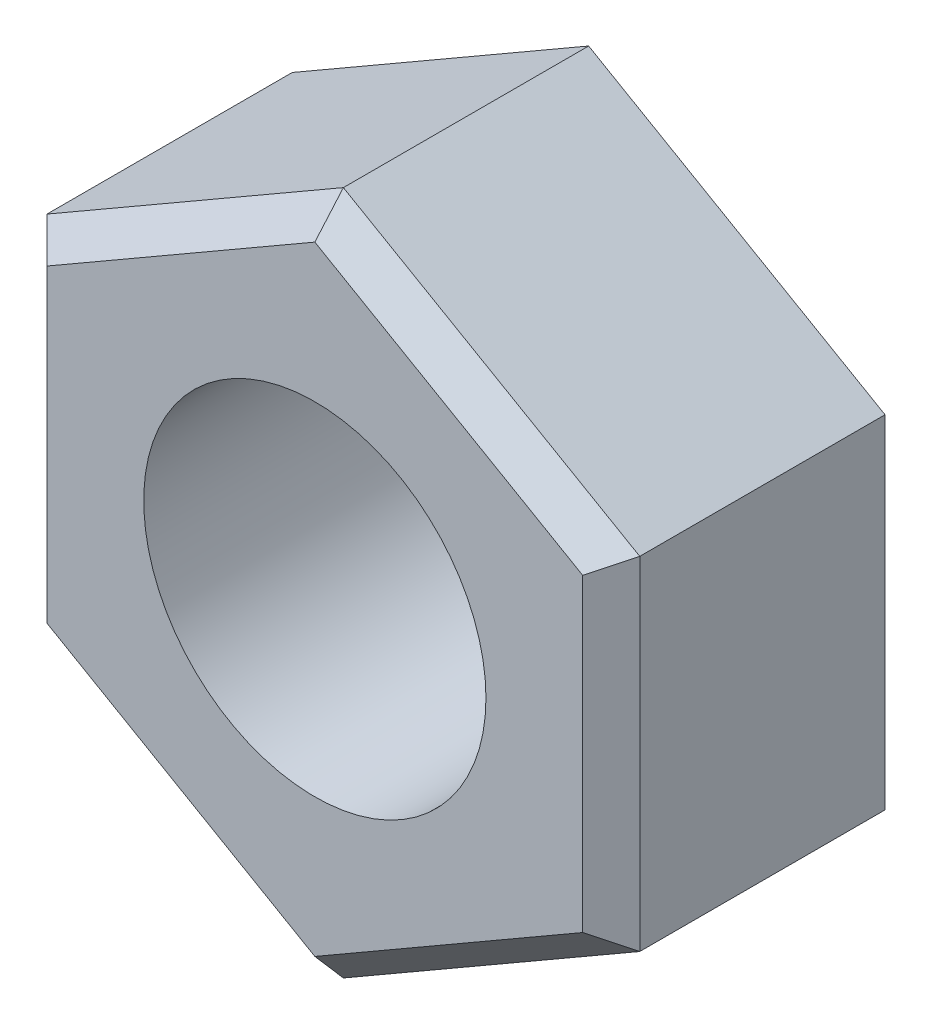
ISO-10303-21;
HEADER;
FILE_DESCRIPTION(('STEP AP214'),'2;1');
FILE_NAME('part.step','',(''),(''),'','','');
FILE_SCHEMA(('AUTOMOTIVE_DESIGN { 1 0 10303 214 1 1 1 1 }'));
ENDSEC;
DATA;
#1=APPLICATION_CONTEXT('core data for automotive mechanical design processes');
#2=APPLICATION_PROTOCOL_DEFINITION('international standard','automotive_design',2000,#1);
#3=PRODUCT_CONTEXT('',#1,'mechanical');
#4=PRODUCT('Part','Part','',(#3));
#5=PRODUCT_RELATED_PRODUCT_CATEGORY('part','',(#4));
#6=PRODUCT_DEFINITION_FORMATION('','',#4);
#7=PRODUCT_DEFINITION_CONTEXT('part definition',#1,'design');
#8=PRODUCT_DEFINITION('design','',#6,#7);
#9=PRODUCT_DEFINITION_SHAPE('','',#8);
#10=(LENGTH_UNIT() NAMED_UNIT(*) SI_UNIT(.MILLI.,.METRE.));
#11=(NAMED_UNIT(*) PLANE_ANGLE_UNIT() SI_UNIT($,.RADIAN.));
#12=(NAMED_UNIT(*) SI_UNIT($,.STERADIAN.) SOLID_ANGLE_UNIT());
#13=UNCERTAINTY_MEASURE_WITH_UNIT(LENGTH_MEASURE(1.E-05),#10,'distance_accuracy_value','');
#14=(GEOMETRIC_REPRESENTATION_CONTEXT(3) GLOBAL_UNCERTAINTY_ASSIGNED_CONTEXT((#13)) GLOBAL_UNIT_ASSIGNED_CONTEXT((#10,
#11,#12)) REPRESENTATION_CONTEXT('',''));
#15=CARTESIAN_POINT('',(0.,0.,0.));
#16=DIRECTION('',(0.,0.,1.));
#17=DIRECTION('',(1.,0.,0.));
#18=AXIS2_PLACEMENT_3D('',#15,#16,#17);
#19=CARTESIAN_POINT('',(0.,0.,2.4));
#20=DIRECTION('',(0.,0.,1.));
#21=DIRECTION('',(1.,0.,0.));
#22=AXIS2_PLACEMENT_3D('',#19,#20,#21);
#23=PLANE('',#22);
#24=DIRECTION('',(0.,1.,0.));
#25=VECTOR('',#24,1.);
#26=CARTESIAN_POINT('',(2.34807621135331,1.50000000000001,2.4));
#27=LINE('',#26,#25);
#28=CARTESIAN_POINT('',(2.34807621135332,-1.35566243270259,2.4));
#29=VERTEX_POINT('',#28);
#30=CARTESIAN_POINT('',(2.34807621135331,1.3556624327026,2.4));
#31=VERTEX_POINT('',#30);
#32=EDGE_CURVE('E175',#29,#31,#27,.T.);
#33=ORIENTED_EDGE('',*,*,#32,.T.);
#34=DIRECTION('',(-0.866025403784442,0.499999999999995,0.));
#35=VECTOR('',#34,1.);
#36=CARTESIAN_POINT('',(-0.125000000000019,2.78349364905389,2.4));
#37=LINE('',#36,#35);
#38=CARTESIAN_POINT('',(0.,2.71132486540519,2.4));
#39=VERTEX_POINT('',#38);
#40=EDGE_CURVE('E187',#31,#39,#37,.T.);
#41=ORIENTED_EDGE('',*,*,#40,.T.);
#42=DIRECTION('',(-0.866025403784435,-0.500000000000007,0.));
#43=VECTOR('',#42,1.);
#44=CARTESIAN_POINT('',(-2.47307621135333,1.28349364905387,2.4));
#45=LINE('',#44,#43);
#46=CARTESIAN_POINT('',(-2.34807621135333,1.35566243270257,2.4));
#47=VERTEX_POINT('',#46);
#48=EDGE_CURVE('E184',#39,#47,#45,.T.);
#49=ORIENTED_EDGE('',*,*,#48,.T.);
#50=DIRECTION('',(0.,-1.,0.));
#51=VECTOR('',#50,1.);
#52=CARTESIAN_POINT('',(-2.3480762113533,-1.50000000000003,2.4));
#53=LINE('',#52,#51);
#54=CARTESIAN_POINT('',(-2.3480762113533,-1.35566243270262,2.4));
#55=VERTEX_POINT('',#54);
#56=EDGE_CURVE('E181',#47,#55,#53,.T.);
#57=ORIENTED_EDGE('',*,*,#56,.T.);
#58=DIRECTION('',(0.866025403784442,-0.499999999999995,0.));
#59=VECTOR('',#58,1.);
#60=CARTESIAN_POINT('',(0.124999999999998,-2.78349364905389,2.4));
#61=LINE('',#60,#59);
#62=CARTESIAN_POINT('',(0.,-2.71132486540519,2.4));
#63=VERTEX_POINT('',#62);
#64=EDGE_CURVE('E178',#55,#63,#61,.T.);
#65=ORIENTED_EDGE('',*,*,#64,.T.);
#66=DIRECTION('',(0.866025403784438,0.500000000000001,0.));
#67=VECTOR('',#66,1.);
#68=CARTESIAN_POINT('',(2.47307621135332,-1.28349364905389,2.4));
#69=LINE('',#68,#67);
#70=EDGE_CURVE('E120',#63,#29,#69,.T.);
#71=ORIENTED_EDGE('',*,*,#70,.T.);
#72=EDGE_LOOP('',(#33,#41,#49,#57,#65,#71));
#73=FACE_BOUND('',#72,.T.);
#74=CARTESIAN_POINT('',(0.,0.,2.4));
#75=DIRECTION('',(0.,0.,1.));
#76=DIRECTION('',(1.,0.,0.));
#77=AXIS2_PLACEMENT_3D('',#74,#75,#76);
#78=CIRCLE('',#77,1.5);
#79=CARTESIAN_POINT('',(1.5,0.,2.4));
#80=VERTEX_POINT('',#79);
#81=EDGE_CURVE('E139',#80,#80,#78,.T.);
#82=ORIENTED_EDGE('',*,*,#81,.F.);
#83=EDGE_LOOP('',(#82));
#84=FACE_BOUND('',#83,.T.);
#85=ADVANCED_FACE('F40',(#73,#84),#23,.T.);
#86=CARTESIAN_POINT('',(0.,0.,0.));
#87=DIRECTION('',(0.,0.,1.));
#88=DIRECTION('',(1.,0.,0.));
#89=AXIS2_PLACEMENT_3D('',#86,#87,#88);
#90=PLANE('',#89);
#91=DIRECTION('',(0.866025403784441,-0.499999999999995,0.));
#92=VECTOR('',#91,1.);
#93=CARTESIAN_POINT('',(-2.5980762113533,-1.50000000000003,0.));
#94=LINE('',#93,#92);
#95=CARTESIAN_POINT('',(-2.5980762113533,-1.50000000000003,0.));
#96=VERTEX_POINT('',#95);
#97=CARTESIAN_POINT('',(0.,-3.,0.));
#98=VERTEX_POINT('',#97);
#99=EDGE_CURVE('E128',#96,#98,#94,.T.);
#100=ORIENTED_EDGE('',*,*,#99,.F.);
#101=DIRECTION('',(0.,-1.,0.));
#102=VECTOR('',#101,1.);
#103=CARTESIAN_POINT('',(-2.59807621135333,1.49999999999998,0.));
#104=LINE('',#103,#102);
#105=CARTESIAN_POINT('',(-2.59807621135333,1.49999999999998,0.));
#106=VERTEX_POINT('',#105);
#107=EDGE_CURVE('E157',#106,#96,#104,.T.);
#108=ORIENTED_EDGE('',*,*,#107,.F.);
#109=DIRECTION('',(-0.866025403784435,-0.500000000000007,0.));
#110=VECTOR('',#109,1.);
#111=CARTESIAN_POINT('',(0.,3.,0.));
#112=LINE('',#111,#110);
#113=CARTESIAN_POINT('',(0.,3.,0.));
#114=VERTEX_POINT('',#113);
#115=EDGE_CURVE('E153',#114,#106,#112,.T.);
#116=ORIENTED_EDGE('',*,*,#115,.F.);
#117=DIRECTION('',(-0.866025403784441,0.499999999999995,0.));
#118=VECTOR('',#117,1.);
#119=CARTESIAN_POINT('',(2.59807621135331,1.50000000000001,0.));
#120=LINE('',#119,#118);
#121=CARTESIAN_POINT('',(2.59807621135331,1.50000000000001,0.));
#122=VERTEX_POINT('',#121);
#123=EDGE_CURVE('E149',#122,#114,#120,.T.);
#124=ORIENTED_EDGE('',*,*,#123,.F.);
#125=DIRECTION('',(0.,1.,0.));
#126=VECTOR('',#125,1.);
#127=CARTESIAN_POINT('',(2.59807621135332,-1.49999999999999,0.));
#128=LINE('',#127,#126);
#129=CARTESIAN_POINT('',(2.59807621135332,-1.49999999999999,0.));
#130=VERTEX_POINT('',#129);
#131=EDGE_CURVE('E131',#130,#122,#128,.T.);
#132=ORIENTED_EDGE('',*,*,#131,.F.);
#133=DIRECTION('',(0.866025403784438,0.500000000000001,0.));
#134=VECTOR('',#133,1.);
#135=CARTESIAN_POINT('',(0.,-3.,0.));
#136=LINE('',#135,#134);
#137=EDGE_CURVE('E114',#98,#130,#136,.T.);
#138=ORIENTED_EDGE('',*,*,#137,.F.);
#139=EDGE_LOOP('',(#100,#108,#116,#124,#132,#138));
#140=FACE_BOUND('',#139,.T.);
#141=CARTESIAN_POINT('',(0.,0.,0.));
#142=DIRECTION('',(0.,0.,1.));
#143=DIRECTION('',(1.,0.,0.));
#144=AXIS2_PLACEMENT_3D('',#141,#142,#143);
#145=CIRCLE('',#144,1.5);
#146=CARTESIAN_POINT('',(1.5,0.,0.));
#147=VERTEX_POINT('',#146);
#148=EDGE_CURVE('E143',#147,#147,#145,.T.);
#149=ORIENTED_EDGE('',*,*,#148,.T.);
#150=EDGE_LOOP('',(#149));
#151=FACE_BOUND('',#150,.T.);
#152=ADVANCED_FACE('F125',(#140,#151),#90,.F.);
#153=CARTESIAN_POINT('',(-2.5980762113533,-1.50000000000003,2.4));
#154=DIRECTION('',(0.499999999999995,0.866025403784441,0.));
#155=DIRECTION('',(-0.866025403784442,0.499999999999995,0.));
#156=AXIS2_PLACEMENT_3D('',#153,#154,#155);
#157=PLANE('',#156);
#158=DIRECTION('',(0.,0.,-1.));
#159=VECTOR('',#158,1.);
#160=CARTESIAN_POINT('',(0.,-3.,2.4));
#161=LINE('',#160,#159);
#162=CARTESIAN_POINT('',(0.,-3.,2.15));
#163=VERTEX_POINT('',#162);
#164=EDGE_CURVE('E111',#163,#98,#161,.T.);
#165=ORIENTED_EDGE('',*,*,#164,.F.);
#166=DIRECTION('',(-0.866025403784442,0.499999999999995,0.));
#167=VECTOR('',#166,1.);
#168=CARTESIAN_POINT('',(-2.5980762113533,-1.50000000000003,2.15));
#169=LINE('',#168,#167);
#170=CARTESIAN_POINT('',(-2.5980762113533,-1.50000000000003,2.15));
#171=VERTEX_POINT('',#170);
#172=EDGE_CURVE('E201',#163,#171,#169,.T.);
#173=ORIENTED_EDGE('',*,*,#172,.T.);
#174=DIRECTION('',(0.,0.,-1.));
#175=VECTOR('',#174,1.);
#176=CARTESIAN_POINT('',(-2.5980762113533,-1.50000000000003,2.4));
#177=LINE('',#176,#175);
#178=EDGE_CURVE('E136',#171,#96,#177,.T.);
#179=ORIENTED_EDGE('',*,*,#178,.T.);
#180=ORIENTED_EDGE('',*,*,#99,.T.);
#181=EDGE_LOOP('',(#165,#173,#179,#180));
#182=FACE_BOUND('',#181,.T.);
#183=ADVANCED_FACE('F134',(#182),#157,.F.);
#184=CARTESIAN_POINT('',(0.,-3.,2.4));
#185=DIRECTION('',(-0.500000000000001,0.866025403784438,0.));
#186=DIRECTION('',(-0.866025403784438,-0.500000000000001,0.));
#187=AXIS2_PLACEMENT_3D('',#184,#185,#186);
#188=PLANE('',#187);
#189=DIRECTION('',(0.,0.,-1.));
#190=VECTOR('',#189,1.);
#191=CARTESIAN_POINT('',(2.59807621135332,-1.49999999999999,2.4));
#192=LINE('',#191,#190);
#193=CARTESIAN_POINT('',(2.59807621135332,-1.49999999999999,2.15));
#194=VERTEX_POINT('',#193);
#195=EDGE_CURVE('E121',#194,#130,#192,.T.);
#196=ORIENTED_EDGE('',*,*,#195,.F.);
#197=DIRECTION('',(-0.866025403784438,-0.500000000000001,0.));
#198=VECTOR('',#197,1.);
#199=CARTESIAN_POINT('',(0.,-3.,2.15));
#200=LINE('',#199,#198);
#201=EDGE_CURVE('E11',#194,#163,#200,.T.);
#202=ORIENTED_EDGE('',*,*,#201,.T.);
#203=ORIENTED_EDGE('',*,*,#164,.T.);
#204=ORIENTED_EDGE('',*,*,#137,.T.);
#205=EDGE_LOOP('',(#196,#202,#203,#204));
#206=FACE_BOUND('',#205,.T.);
#207=ADVANCED_FACE('F113',(#206),#188,.F.);
#208=CARTESIAN_POINT('',(2.59807621135332,-1.49999999999999,2.4));
#209=DIRECTION('',(-1.,0.,0.));
#210=DIRECTION('',(0.,-1.,0.));
#211=AXIS2_PLACEMENT_3D('',#208,#209,#210);
#212=PLANE('',#211);
#213=DIRECTION('',(0.,0.,-1.));
#214=VECTOR('',#213,1.);
#215=CARTESIAN_POINT('',(2.59807621135331,1.50000000000001,2.4));
#216=LINE('',#215,#214);
#217=CARTESIAN_POINT('',(2.59807621135331,1.50000000000001,2.15));
#218=VERTEX_POINT('',#217);
#219=EDGE_CURVE('E168',#218,#122,#216,.T.);
#220=ORIENTED_EDGE('',*,*,#219,.F.);
#221=DIRECTION('',(0.,-1.,0.));
#222=VECTOR('',#221,1.);
#223=CARTESIAN_POINT('',(2.59807621135332,-1.49999999999999,2.15));
#224=LINE('',#223,#222);
#225=EDGE_CURVE('E51',#218,#194,#224,.T.);
#226=ORIENTED_EDGE('',*,*,#225,.T.);
#227=ORIENTED_EDGE('',*,*,#195,.T.);
#228=ORIENTED_EDGE('',*,*,#131,.T.);
#229=EDGE_LOOP('',(#220,#226,#227,#228));
#230=FACE_BOUND('',#229,.T.);
#231=ADVANCED_FACE('F266',(#230),#212,.F.);
#232=CARTESIAN_POINT('',(2.59807621135331,1.50000000000001,2.4));
#233=DIRECTION('',(-0.499999999999995,-0.866025403784441,0.));
#234=DIRECTION('',(0.866025403784442,-0.499999999999995,0.));
#235=AXIS2_PLACEMENT_3D('',#232,#233,#234);
#236=PLANE('',#235);
#237=DIRECTION('',(0.,0.,-1.));
#238=VECTOR('',#237,1.);
#239=CARTESIAN_POINT('',(0.,3.,2.4));
#240=LINE('',#239,#238);
#241=CARTESIAN_POINT('',(0.,3.,2.15));
#242=VERTEX_POINT('',#241);
#243=EDGE_CURVE('E165',#242,#114,#240,.T.);
#244=ORIENTED_EDGE('',*,*,#243,.F.);
#245=DIRECTION('',(0.866025403784442,-0.499999999999995,0.));
#246=VECTOR('',#245,1.);
#247=CARTESIAN_POINT('',(2.59807621135331,1.50000000000001,2.15));
#248=LINE('',#247,#246);
#249=EDGE_CURVE('E191',#242,#218,#248,.T.);
#250=ORIENTED_EDGE('',*,*,#249,.T.);
#251=ORIENTED_EDGE('',*,*,#219,.T.);
#252=ORIENTED_EDGE('',*,*,#123,.T.);
#253=EDGE_LOOP('',(#244,#250,#251,#252));
#254=FACE_BOUND('',#253,.T.);
#255=ADVANCED_FACE('F262',(#254),#236,.F.);
#256=CARTESIAN_POINT('',(0.,3.,2.4));
#257=DIRECTION('',(0.500000000000007,-0.866025403784435,0.));
#258=DIRECTION('',(0.866025403784435,0.500000000000007,0.));
#259=AXIS2_PLACEMENT_3D('',#256,#257,#258);
#260=PLANE('',#259);
#261=DIRECTION('',(0.,0.,-1.));
#262=VECTOR('',#261,1.);
#263=CARTESIAN_POINT('',(-2.59807621135333,1.49999999999998,2.4));
#264=LINE('',#263,#262);
#265=CARTESIAN_POINT('',(-2.59807621135333,1.49999999999998,2.15));
#266=VERTEX_POINT('',#265);
#267=EDGE_CURVE('E162',#266,#106,#264,.T.);
#268=ORIENTED_EDGE('',*,*,#267,.F.);
#269=DIRECTION('',(0.866025403784435,0.500000000000007,0.));
#270=VECTOR('',#269,1.);
#271=CARTESIAN_POINT('',(0.,3.,2.15));
#272=LINE('',#271,#270);
#273=EDGE_CURVE('E195',#266,#242,#272,.T.);
#274=ORIENTED_EDGE('',*,*,#273,.T.);
#275=ORIENTED_EDGE('',*,*,#243,.T.);
#276=ORIENTED_EDGE('',*,*,#115,.T.);
#277=EDGE_LOOP('',(#268,#274,#275,#276));
#278=FACE_BOUND('',#277,.T.);
#279=ADVANCED_FACE('F247',(#278),#260,.F.);
#280=CARTESIAN_POINT('',(-2.59807621135333,1.49999999999998,2.4));
#281=DIRECTION('',(1.,0.,0.));
#282=DIRECTION('',(0.,1.,0.));
#283=AXIS2_PLACEMENT_3D('',#280,#281,#282);
#284=PLANE('',#283);
#285=ORIENTED_EDGE('',*,*,#178,.F.);
#286=DIRECTION('',(0.,1.,0.));
#287=VECTOR('',#286,1.);
#288=CARTESIAN_POINT('',(-2.59807621135333,1.49999999999998,2.15));
#289=LINE('',#288,#287);
#290=EDGE_CURVE('E198',#171,#266,#289,.T.);
#291=ORIENTED_EDGE('',*,*,#290,.T.);
#292=ORIENTED_EDGE('',*,*,#267,.T.);
#293=ORIENTED_EDGE('',*,*,#107,.T.);
#294=EDGE_LOOP('',(#285,#291,#292,#293));
#295=FACE_BOUND('',#294,.T.);
#296=ADVANCED_FACE('F237',(#295),#284,.F.);
#297=CARTESIAN_POINT('',(0.,0.,2.4));
#298=DIRECTION('',(0.,0.,-1.));
#299=DIRECTION('',(-1.,0.,0.));
#300=AXIS2_PLACEMENT_3D('',#297,#298,#299);
#301=CYLINDRICAL_SURFACE('',#300,1.5);
#302=ORIENTED_EDGE('',*,*,#81,.T.);
#303=EDGE_LOOP('',(#302));
#304=FACE_BOUND('',#303,.T.);
#305=ORIENTED_EDGE('',*,*,#148,.F.);
#306=EDGE_LOOP('',(#305));
#307=FACE_BOUND('',#306,.T.);
#308=ADVANCED_FACE('F235',(#304,#307),#301,.F.);
#309=CARTESIAN_POINT('',(-1.17403810567665,-2.03349364905391,2.4));
#310=DIRECTION('',(-0.353553390593272,-0.612372435695799,0.707106781186545));
#311=DIRECTION('',(-0.866025403784442,0.499999999999995,0.));
#312=AXIS2_PLACEMENT_3D('',#309,#310,#311);
#313=PLANE('',#312);
#314=DIRECTION('',(-0.654653670707972,-0.37796447300923,-0.65465367070798));
#315=VECTOR('',#314,1.);
#316=CARTESIAN_POINT('',(-2.01263675258855,-1.16199637088797,2.73543945876476));
#317=LINE('',#316,#315);
#318=EDGE_CURVE('E219',#171,#55,#317,.F.);
#319=ORIENTED_EDGE('',*,*,#318,.F.);
#320=ORIENTED_EDGE('',*,*,#172,.F.);
#321=DIRECTION('',(0.,-0.755928946018452,-0.654653670707981));
#322=VECTOR('',#321,1.);
#323=CARTESIAN_POINT('',(0.,-2.32399274177588,2.73543945876476));
#324=LINE('',#323,#322);
#325=EDGE_CURVE('E45',#63,#163,#324,.T.);
#326=ORIENTED_EDGE('',*,*,#325,.F.);
#327=ORIENTED_EDGE('',*,*,#64,.F.);
#328=EDGE_LOOP('',(#319,#320,#326,#327));
#329=FACE_BOUND('',#328,.T.);
#330=ADVANCED_FACE('F43',(#329),#313,.T.);
#331=CARTESIAN_POINT('',(1.17403810567666,-2.03349364905389,2.4));
#332=DIRECTION('',(0.353553390593276,-0.612372435695797,0.707106781186545));
#333=DIRECTION('',(-0.866025403784438,-0.500000000000001,0.));
#334=AXIS2_PLACEMENT_3D('',#331,#332,#333);
#335=PLANE('',#334);
#336=ORIENTED_EDGE('',*,*,#325,.T.);
#337=ORIENTED_EDGE('',*,*,#201,.F.);
#338=DIRECTION('',(-0.654653670707977,0.377964473009223,0.654653670707979));
#339=VECTOR('',#338,1.);
#340=CARTESIAN_POINT('',(2.01263675258856,-1.16199637088793,2.73543945876476));
#341=LINE('',#340,#339);
#342=EDGE_CURVE('E216',#29,#194,#341,.F.);
#343=ORIENTED_EDGE('',*,*,#342,.F.);
#344=ORIENTED_EDGE('',*,*,#70,.F.);
#345=EDGE_LOOP('',(#336,#337,#343,#344));
#346=FACE_BOUND('',#345,.T.);
#347=ADVANCED_FACE('F244',(#346),#335,.T.);
#348=CARTESIAN_POINT('',(-2.34807621135331,0.,2.4));
#349=DIRECTION('',(-0.70710678118655,0.,0.707106781186545));
#350=DIRECTION('',(0.,1.,0.));
#351=AXIS2_PLACEMENT_3D('',#348,#349,#350);
#352=PLANE('',#351);
#353=ORIENTED_EDGE('',*,*,#318,.T.);
#354=ORIENTED_EDGE('',*,*,#56,.F.);
#355=DIRECTION('',(-0.654653670707979,0.377964473009219,-0.654653670707979));
#356=VECTOR('',#355,1.);
#357=CARTESIAN_POINT('',(-2.01263675258857,1.16199637088792,2.73543945876476));
#358=LINE('',#357,#356);
#359=EDGE_CURVE('E212',#266,#47,#358,.F.);
#360=ORIENTED_EDGE('',*,*,#359,.F.);
#361=ORIENTED_EDGE('',*,*,#290,.F.);
#362=EDGE_LOOP('',(#353,#354,#360,#361));
#363=FACE_BOUND('',#362,.T.);
#364=ADVANCED_FACE('F294',(#363),#352,.T.);
#365=CARTESIAN_POINT('',(2.34807621135331,0.,2.4));
#366=DIRECTION('',(0.70710678118655,0.,0.707106781186545));
#367=DIRECTION('',(0.,-1.,0.));
#368=AXIS2_PLACEMENT_3D('',#365,#366,#367);
#369=PLANE('',#368);
#370=ORIENTED_EDGE('',*,*,#342,.T.);
#371=ORIENTED_EDGE('',*,*,#225,.F.);
#372=DIRECTION('',(-0.654653670707974,-0.377964473009228,0.654653670707979));
#373=VECTOR('',#372,1.);
#374=CARTESIAN_POINT('',(2.01263675258855,1.16199637088795,2.73543945876476));
#375=LINE('',#374,#373);
#376=EDGE_CURVE('E209',#31,#218,#375,.F.);
#377=ORIENTED_EDGE('',*,*,#376,.F.);
#378=ORIENTED_EDGE('',*,*,#32,.F.);
#379=EDGE_LOOP('',(#370,#371,#377,#378));
#380=FACE_BOUND('',#379,.T.);
#381=ADVANCED_FACE('F287',(#380),#369,.T.);
#382=CARTESIAN_POINT('',(-1.17403810567667,2.03349364905388,2.4));
#383=DIRECTION('',(-0.35355339059328,0.612372435695794,0.707106781186545));
#384=DIRECTION('',(0.866025403784435,0.500000000000007,0.));
#385=AXIS2_PLACEMENT_3D('',#382,#383,#384);
#386=PLANE('',#385);
#387=ORIENTED_EDGE('',*,*,#359,.T.);
#388=ORIENTED_EDGE('',*,*,#48,.F.);
#389=DIRECTION('',(0.,0.755928946018452,-0.65465367070798));
#390=VECTOR('',#389,1.);
#391=CARTESIAN_POINT('',(0.,2.32399274177588,2.73543945876476));
#392=LINE('',#391,#390);
#393=EDGE_CURVE('E206',#242,#39,#392,.F.);
#394=ORIENTED_EDGE('',*,*,#393,.F.);
#395=ORIENTED_EDGE('',*,*,#273,.F.);
#396=EDGE_LOOP('',(#387,#388,#394,#395));
#397=FACE_BOUND('',#396,.T.);
#398=ADVANCED_FACE('F280',(#397),#386,.T.);
#399=CARTESIAN_POINT('',(1.17403810567665,2.0334936490539,2.4));
#400=DIRECTION('',(0.353553390593272,0.612372435695799,0.707106781186545));
#401=DIRECTION('',(0.866025403784442,-0.499999999999995,0.));
#402=AXIS2_PLACEMENT_3D('',#399,#400,#401);
#403=PLANE('',#402);
#404=ORIENTED_EDGE('',*,*,#376,.T.);
#405=ORIENTED_EDGE('',*,*,#249,.F.);
#406=ORIENTED_EDGE('',*,*,#393,.T.);
#407=ORIENTED_EDGE('',*,*,#40,.F.);
#408=EDGE_LOOP('',(#404,#405,#406,#407));
#409=FACE_BOUND('',#408,.T.);
#410=ADVANCED_FACE('F274',(#409),#403,.T.);
#411=CLOSED_SHELL('',(#85,#152,#183,#207,#231,#255,#279,#296,#308,#330,#347,#364,#381,#398,#410));
#412=MANIFOLD_SOLID_BREP('B2',#411);
#413=ADVANCED_BREP_SHAPE_REPRESENTATION('',(#18,#412),#14);
#414=SHAPE_DEFINITION_REPRESENTATION(#9,#413);
ENDSEC;
END-ISO-10303-21;
